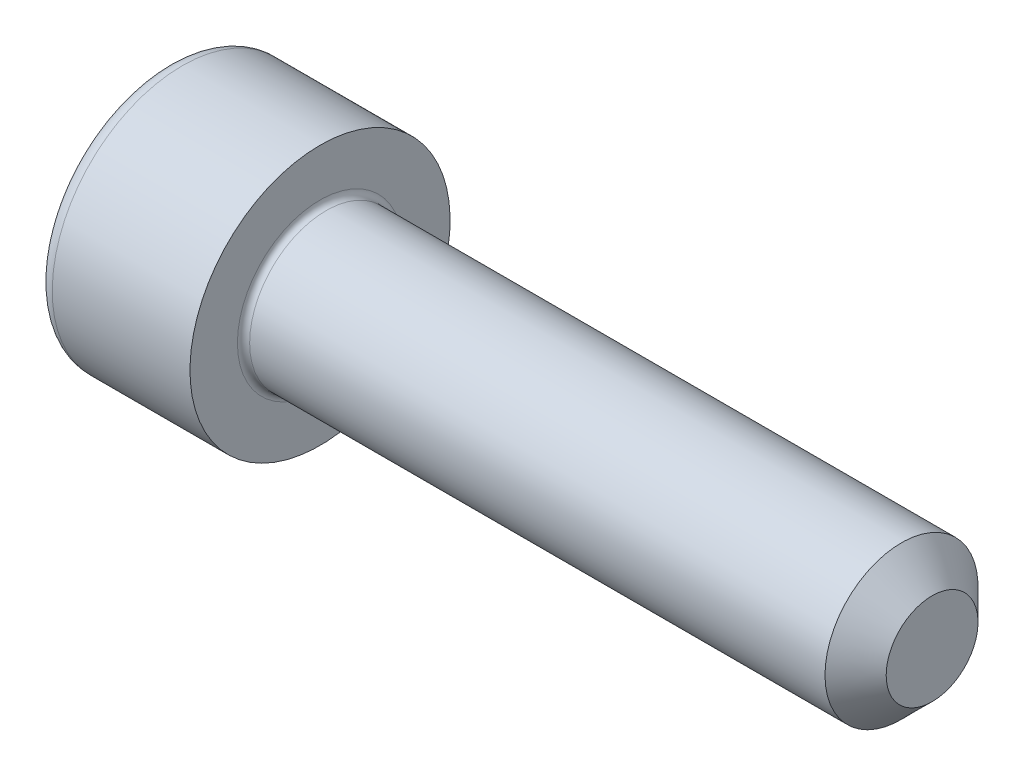
ISO-10303-21;
HEADER;
FILE_DESCRIPTION(('STEP AP214'),'2;1');
FILE_NAME('part.step','',(''),(''),'','','');
FILE_SCHEMA(('AUTOMOTIVE_DESIGN { 1 0 10303 214 1 1 1 1 }'));
ENDSEC;
DATA;
#1=APPLICATION_CONTEXT('core data for automotive mechanical design processes');
#2=APPLICATION_PROTOCOL_DEFINITION('international standard','automotive_design',2000,#1);
#3=PRODUCT_CONTEXT('',#1,'mechanical');
#4=PRODUCT('Part','Part','',(#3));
#5=PRODUCT_RELATED_PRODUCT_CATEGORY('part','',(#4));
#6=PRODUCT_DEFINITION_FORMATION('','',#4);
#7=PRODUCT_DEFINITION_CONTEXT('part definition',#1,'design');
#8=PRODUCT_DEFINITION('design','',#6,#7);
#9=PRODUCT_DEFINITION_SHAPE('','',#8);
#10=(LENGTH_UNIT() NAMED_UNIT(*) SI_UNIT(.MILLI.,.METRE.));
#11=(NAMED_UNIT(*) PLANE_ANGLE_UNIT() SI_UNIT($,.RADIAN.));
#12=(NAMED_UNIT(*) SI_UNIT($,.STERADIAN.) SOLID_ANGLE_UNIT());
#13=UNCERTAINTY_MEASURE_WITH_UNIT(LENGTH_MEASURE(1.E-05),#10,'distance_accuracy_value','');
#14=(GEOMETRIC_REPRESENTATION_CONTEXT(3) GLOBAL_UNCERTAINTY_ASSIGNED_CONTEXT((#13)) GLOBAL_UNIT_ASSIGNED_CONTEXT((#10,
#11,#12)) REPRESENTATION_CONTEXT('',''));
#15=CARTESIAN_POINT('',(0.,0.,0.));
#16=DIRECTION('',(0.,0.,1.));
#17=DIRECTION('',(1.,0.,0.));
#18=AXIS2_PLACEMENT_3D('',#15,#16,#17);
#19=CARTESIAN_POINT('',(-5.,0.,0.));
#20=DIRECTION('',(-1.,0.,0.));
#21=DIRECTION('',(0.,1.,0.));
#22=AXIS2_PLACEMENT_3D('',#19,#20,#21);
#23=PLANE('',#22);
#24=CARTESIAN_POINT('',(-5.,0.,0.));
#25=DIRECTION('',(1.,0.,0.));
#26=DIRECTION('',(0.,1.,0.));
#27=AXIS2_PLACEMENT_3D('',#24,#25,#26);
#28=CIRCLE('',#27,3.75);
#29=CARTESIAN_POINT('',(-5.,3.75,0.));
#30=VERTEX_POINT('',#29);
#31=EDGE_CURVE('E11',#30,#30,#28,.T.);
#32=ORIENTED_EDGE('',*,*,#31,.F.);
#33=EDGE_LOOP('',(#32));
#34=FACE_BOUND('',#33,.T.);
#35=DIRECTION('',(0.,0.500000000000001,-0.866025403784438));
#36=VECTOR('',#35,1.);
#37=CARTESIAN_POINT('',(-5.,1.15470053837925,2.));
#38=LINE('',#37,#36);
#39=CARTESIAN_POINT('',(-5.,1.15470053837925,2.));
#40=VERTEX_POINT('',#39);
#41=CARTESIAN_POINT('',(-5.,2.30940107675851,0.));
#42=VERTEX_POINT('',#41);
#43=EDGE_CURVE('E24',#40,#42,#38,.T.);
#44=ORIENTED_EDGE('',*,*,#43,.F.);
#45=DIRECTION('',(0.,1.,0.));
#46=VECTOR('',#45,1.);
#47=CARTESIAN_POINT('',(-5.,-1.15470053837925,2.));
#48=LINE('',#47,#46);
#49=CARTESIAN_POINT('',(-5.,-1.15470053837925,2.));
#50=VERTEX_POINT('',#49);
#51=EDGE_CURVE('E184',#50,#40,#48,.T.);
#52=ORIENTED_EDGE('',*,*,#51,.F.);
#53=DIRECTION('',(0.,0.5,0.866025403784439));
#54=VECTOR('',#53,1.);
#55=CARTESIAN_POINT('',(-5.,-2.30940107675851,0.));
#56=LINE('',#55,#54);
#57=CARTESIAN_POINT('',(-5.,-2.30940107675851,0.));
#58=VERTEX_POINT('',#57);
#59=EDGE_CURVE('E226',#58,#50,#56,.T.);
#60=ORIENTED_EDGE('',*,*,#59,.F.);
#61=DIRECTION('',(0.,-0.5,0.866025403784439));
#62=VECTOR('',#61,1.);
#63=CARTESIAN_POINT('',(-5.,-1.15470053837925,-2.));
#64=LINE('',#63,#62);
#65=CARTESIAN_POINT('',(-5.,-1.15470053837925,-2.));
#66=VERTEX_POINT('',#65);
#67=EDGE_CURVE('E133',#66,#58,#64,.T.);
#68=ORIENTED_EDGE('',*,*,#67,.F.);
#69=DIRECTION('',(0.,-1.,0.));
#70=VECTOR('',#69,1.);
#71=CARTESIAN_POINT('',(-5.,1.15470053837925,-2.));
#72=LINE('',#71,#70);
#73=CARTESIAN_POINT('',(-5.,1.15470053837925,-2.));
#74=VERTEX_POINT('',#73);
#75=EDGE_CURVE('E117',#74,#66,#72,.T.);
#76=ORIENTED_EDGE('',*,*,#75,.F.);
#77=DIRECTION('',(0.,-0.5,-0.866025403784439));
#78=VECTOR('',#77,1.);
#79=CARTESIAN_POINT('',(-5.,2.30940107675851,0.));
#80=LINE('',#79,#78);
#81=EDGE_CURVE('E111',#42,#74,#80,.T.);
#82=ORIENTED_EDGE('',*,*,#81,.F.);
#83=EDGE_LOOP('',(#44,#52,#60,#68,#76,#82));
#84=FACE_BOUND('',#83,.T.);
#85=ADVANCED_FACE('F17',(#34,#84),#23,.T.);
#86=CARTESIAN_POINT('',(-2.5,0.,0.));
#87=DIRECTION('',(-1.,0.,0.));
#88=DIRECTION('',(0.,0.,1.));
#89=AXIS2_PLACEMENT_3D('',#86,#87,#88);
#90=CONICAL_SURFACE('',#89,2.3094010767585,1.0471975511966);
#91=CARTESIAN_POINT('',(-1.16666666666667,0.,0.));
#92=VERTEX_POINT('',#91);
#93=VERTEX_LOOP('',#92);
#94=FACE_BOUND('',#93,.T.);
#95=CARTESIAN_POINT('',(-2.32136720504583,0.,1.99999999999985));
#96=CARTESIAN_POINT('',(-2.32131550241813,0.0797196102101617,2.00000000000306));
#97=CARTESIAN_POINT('',(-2.32411866043126,0.159413689200123,2.00000000000183));
#98=CARTESIAN_POINT('',(-2.33502998791878,0.318342403087673,1.99999999999818));
#99=CARTESIAN_POINT('',(-2.3431315531358,0.397577486228106,1.99999999999578));
#100=CARTESIAN_POINT('',(-2.36424196790677,0.555418039197688,1.99999999999748));
#101=CARTESIAN_POINT('',(-2.37725319872079,0.634023184574532,2.0000000000016));
#102=CARTESIAN_POINT('',(-2.40754514450711,0.790421298244566,1.99999999999841));
#103=CARTESIAN_POINT('',(-2.42482740199922,0.868213962499915,1.9999999999911));
#104=CARTESIAN_POINT('',(-2.46120934199551,1.01564572423579,1.99999999999472));
#105=CARTESIAN_POINT('',(-2.47998586173831,1.08536436762664,2.00000000000401));
#106=CARTESIAN_POINT('',(-2.5,1.15470053832392,2.00000000003195));
#107=B_SPLINE_CURVE_WITH_KNOTS('',3,(#95,#96,#97,#98,#99,#100,#101,#102,#103,#104,#105,#106),
.UNSPECIFIED.,.F.,.F.,(4,2,2,2,2,4),(0.,0.239068538986219,0.477839654877296,0.716726727438717,
0.955700202629129,1.17222815680731),.UNSPECIFIED.);
#108=CARTESIAN_POINT('',(-2.32136720504592,0.,2.));
#109=VERTEX_POINT('',#108);
#110=CARTESIAN_POINT('',(-2.49999999997221,1.15470053837925,2.));
#111=VERTEX_POINT('',#110);
#112=EDGE_CURVE('E179',#109,#111,#107,.T.);
#113=ORIENTED_EDGE('',*,*,#112,.T.);
#114=CARTESIAN_POINT('',(-2.49999999998611,1.15470053843378,1.99999999996852));
#115=CARTESIAN_POINT('',(-2.46228362849492,1.21997972300278,1.88693313528492));
#116=CARTESIAN_POINT('',(-2.42898652027917,1.28598045813641,1.77261650884483));
#117=CARTESIAN_POINT('',(-2.38655404777783,1.38958352282162,1.59317073714211));
#118=CARTESIAN_POINT('',(-2.37325675430922,1.42677343092606,1.52875592681503));
#119=CARTESIAN_POINT('',(-2.35093110027913,1.50147465395394,1.39936961300656));
#120=CARTESIAN_POINT('',(-2.34190226311298,1.53898593251758,1.33439817250222));
#121=CARTESIAN_POINT('',(-2.32591051793947,1.62921268695325,1.17812084989304));
#122=CARTESIAN_POINT('',(-2.32120225532939,1.68203400845146,1.08663163806296));
#123=CARTESIAN_POINT('',(-2.3215412281579,1.78767402974622,0.903657752348425));
#124=CARTESIAN_POINT('',(-2.32659003039377,1.84049272775946,0.812173081552283));
#125=CARTESIAN_POINT('',(-2.3460152406712,1.94632453428992,0.628867016694233));
#126=CARTESIAN_POINT('',(-2.36050249725211,1.99933241122694,0.537054684062406));
#127=CARTESIAN_POINT('',(-2.39754913624201,2.10464742363962,0.354643728709719));
#128=CARTESIAN_POINT('',(-2.42011316511624,2.15695413773811,0.264045835829832));
#129=CARTESIAN_POINT('',(-2.46265071941254,2.2425451198808,0.115797904891742));
#130=CARTESIAN_POINT('',(-2.48075490199722,2.27606376499449,0.0577419105088828));
#131=CARTESIAN_POINT('',(-2.49999999998611,2.3094010767585,5.73148604723116E-11));
#132=B_SPLINE_CURVE_WITH_KNOTS('',3,(#114,#115,#116,#117,#118,#119,#120,#121,#122,#123,#124,
#125,#126,#127,#128,#129,#130,#131),.UNSPECIFIED.,.F.,.F.,(4,2,2,2,2,2,2,2,4),(0.,
0.407777568841093,0.634364418722332,0.860925962529872,1.17771289725812,1.49455070611276,
1.81517832748425,2.13599069911638,2.34422944405424),.UNSPECIFIED.);
#133=CARTESIAN_POINT('',(-2.49999999997221,2.30940107675851,0.));
#134=VERTEX_POINT('',#133);
#135=EDGE_CURVE('E165',#111,#134,#132,.T.);
#136=ORIENTED_EDGE('',*,*,#135,.T.);
#137=CARTESIAN_POINT('',(-2.49999999998611,2.3094010767585,-6.38932573467605E-11));
#138=CARTESIAN_POINT('',(-2.4622836284956,2.24412189190189,-0.113066864578103));
#139=CARTESIAN_POINT('',(-2.42898652028046,2.17812115689804,-0.227383491089732));
#140=CARTESIAN_POINT('',(-2.38655404777963,2.07451809234659,-0.406829262864516));
#141=CARTESIAN_POINT('',(-2.37325675431111,2.03732818427636,-0.471244073209609));
#142=CARTESIAN_POINT('',(-2.35093110028098,1.96262696113167,-0.600630386947137));
#143=CARTESIAN_POINT('',(-2.34190226311472,1.92511568241702,-0.665601827362531));
#144=CARTESIAN_POINT('',(-2.32591051794074,1.83488892822205,-0.821879150105676));
#145=CARTESIAN_POINT('',(-2.32120225533013,1.7820676073555,-0.91336836229718));
#146=CARTESIAN_POINT('',(-2.32154122815707,1.67642758474773,-1.09634224724721));
#147=CARTESIAN_POINT('',(-2.3265900303919,1.62360888478942,-1.18782691691719));
#148=CARTESIAN_POINT('',(-2.3460152406666,1.51777707922394,-1.37113298232285));
#149=CARTESIAN_POINT('',(-2.36050249724555,1.46476920525531,-1.46294531666216));
#150=CARTESIAN_POINT('',(-2.39754913623093,1.359454190203,-1.64535627047848));
#151=CARTESIAN_POINT('',(-2.42011316510261,1.30714747049154,-1.73595416011166));
#152=CARTESIAN_POINT('',(-2.46265071940074,1.2215564873035,-1.88420209046589));
#153=CARTESIAN_POINT('',(-2.48075490199095,1.18803784387184,-1.94225808584523));
#154=CARTESIAN_POINT('',(-2.4999999999861,1.15470053842888,-1.99999999997135));
#155=B_SPLINE_CURVE_WITH_KNOTS('',3,(#137,#138,#139,#140,#141,#142,#143,#144,#145,#146,#147,
#148,#149,#150,#151,#152,#153,#154),.UNSPECIFIED.,.F.,.F.,(4,2,2,2,2,2,2,2,4),(0.,
0.407777568832167,0.634364418708909,0.860925962511965,1.17771289723187,1.49455070607814,
1.81517832743263,2.13599069904778,2.3442294440535),.UNSPECIFIED.);
#156=CARTESIAN_POINT('',(-2.49999999997221,1.15470053837925,-2.));
#157=VERTEX_POINT('',#156);
#158=EDGE_CURVE('E151',#134,#157,#155,.T.);
#159=ORIENTED_EDGE('',*,*,#158,.T.);
#160=CARTESIAN_POINT('',(-2.4999999999861,1.15470053832392,-2.00000000003195));
#161=CARTESIAN_POINT('',(-2.46228362849563,1.02414216890014,-1.99999999986489));
#162=CARTESIAN_POINT('',(-2.4289865202805,0.892140698764289,-1.99999999993892));
#163=CARTESIAN_POINT('',(-2.38655404777969,0.684934569530033,-2.00000000001483));
#164=CARTESIAN_POINT('',(-2.37325675431117,0.610554753356163,-2.00000000003416));
#165=CARTESIAN_POINT('',(-2.35093110028104,0.461152307185191,-1.99999999996585));
#166=CARTESIAN_POINT('',(-2.34190226311477,0.386129749907719,-1.99999999987822));
#167=CARTESIAN_POINT('',(-2.32591051794077,0.205676241279372,-2.00000000001593));
#168=CARTESIAN_POINT('',(-2.32120225533015,0.100033598916102,-2.00000000037981));
#169=CARTESIAN_POINT('',(-2.32154122815705,-0.111246444983501,-1.99999999962013));
#170=CARTESIAN_POINT('',(-2.32659003039185,-0.216883842953614,-1.99999999849635));
#171=CARTESIAN_POINT('',(-2.34601524066647,-0.428547455045295,-1.9999999990511));
#172=CARTESIAN_POINT('',(-2.36050249724539,-0.534563205948143,-2.00000000076332));
#173=CARTESIAN_POINT('',(-2.39754913623069,-0.74519323340766,-1.99999999923624));
#174=CARTESIAN_POINT('',(-2.42011316510232,-0.849806667214919,-1.99999999599407));
#175=CARTESIAN_POINT('',(-2.4626507194005,-1.02098863255456,-1.99999999539546));
#176=CARTESIAN_POINT('',(-2.48075490199082,-1.08802592111134,-1.99999999637292));
#177=CARTESIAN_POINT('',(-2.4999999999861,-1.15470053832962,-2.00000000002866));
#178=B_SPLINE_CURVE_WITH_KNOTS('',3,(#160,#161,#162,#163,#164,#165,#166,#167,#168,#169,#170,
#171,#172,#173,#174,#175,#176,#177),.UNSPECIFIED.,.F.,.F.,(4,2,2,2,2,2,2,2,4),(0.,
0.407777568831901,0.634364418708497,0.860925962511407,1.1777128972311,1.49455070607716,
1.81517832743144,2.13599069904639,2.3442294440535),.UNSPECIFIED.);
#179=CARTESIAN_POINT('',(-2.49999999997221,-1.15470053837925,-2.));
#180=VERTEX_POINT('',#179);
#181=EDGE_CURVE('E126',#157,#180,#178,.T.);
#182=ORIENTED_EDGE('',*,*,#181,.T.);
#183=CARTESIAN_POINT('',(-2.4999999999861,-1.15470053843459,-1.99999999996805));
#184=CARTESIAN_POINT('',(-2.46228362849561,-1.21997972300183,-1.88693313528679));
#185=CARTESIAN_POINT('',(-2.42898652028047,-1.28598045813391,-1.77261650884921));
#186=CARTESIAN_POINT('',(-2.38655404777964,-1.38958352281684,-1.59317073715036));
#187=CARTESIAN_POINT('',(-2.37325675431112,-1.42677343092053,-1.5287559268246));
#188=CARTESIAN_POINT('',(-2.35093110028099,-1.50147465394689,-1.39936961301878));
#189=CARTESIAN_POINT('',(-2.34190226311473,-1.53898593250976,-1.33439817251576));
#190=CARTESIAN_POINT('',(-2.32591051794074,-1.62921268694325,-1.17812084991035));
#191=CARTESIAN_POINT('',(-2.32120225533014,-1.68203400844004,-1.08663163808273));
#192=CARTESIAN_POINT('',(-2.32154122815707,-1.787674029732,-0.903657752373051));
#193=CARTESIAN_POINT('',(-2.32659003039189,-1.84049272774386,-0.812173081579306));
#194=CARTESIAN_POINT('',(-2.34601524066657,-1.94632453427018,-0.62886701672843));
#195=CARTESIAN_POINT('',(-2.36050249724552,-1.99933241120445,-0.537054684101358));
#196=CARTESIAN_POINT('',(-2.39754913623088,-2.10464742361175,-0.354643728757994));
#197=CARTESIAN_POINT('',(-2.42011316510254,-2.1569541377076,-0.264045835882673));
#198=CARTESIAN_POINT('',(-2.46265071940069,-2.24254511985885,-0.115797904929758));
#199=CARTESIAN_POINT('',(-2.48075490199092,-2.27606376498357,-0.0577419105277827));
#200=CARTESIAN_POINT('',(-2.49999999998611,-2.3094010767585,-5.7309482651391E-11));
#201=B_SPLINE_CURVE_WITH_KNOTS('',3,(#183,#184,#185,#186,#187,#188,#189,#190,#191,#192,#193,
#194,#195,#196,#197,#198,#199,#200),.UNSPECIFIED.,.F.,.F.,(4,2,2,2,2,2,2,2,4),(0.,
0.407777568832121,0.634364418708837,0.860925962511868,1.17771289723173,1.49455070607796,
1.81517832743237,2.13599069904745,2.3442294440535),.UNSPECIFIED.);
#202=CARTESIAN_POINT('',(-2.49999999997221,-2.30940107675851,0.));
#203=VERTEX_POINT('',#202);
#204=EDGE_CURVE('E158',#180,#203,#201,.T.);
#205=ORIENTED_EDGE('',*,*,#204,.T.);
#206=CARTESIAN_POINT('',(-2.49999999998611,-2.3094010767585,6.38977724912849E-11));
#207=CARTESIAN_POINT('',(-2.46228362849561,-2.24412189190191,0.113066864578085));
#208=CARTESIAN_POINT('',(-2.42898652028047,-2.17812115689806,0.227383491089691));
#209=CARTESIAN_POINT('',(-2.38655404777965,-2.07451809234663,0.406829262864438));
#210=CARTESIAN_POINT('',(-2.37325675431113,-2.03732818427642,0.471244073209517));
#211=CARTESIAN_POINT('',(-2.350931100281,-1.96262696113174,0.600630386947018));
#212=CARTESIAN_POINT('',(-2.34190226311473,-1.9251156824171,0.665601827362399));
#213=CARTESIAN_POINT('',(-2.32591051794075,-1.83488892822215,0.821879150105511));
#214=CARTESIAN_POINT('',(-2.32120225533014,-1.78206760735561,0.913368362296995));
#215=CARTESIAN_POINT('',(-2.32154122815707,-1.67642758474786,1.09634224724699));
#216=CARTESIAN_POINT('',(-2.32659003039189,-1.62360888478956,1.18782691691694));
#217=CARTESIAN_POINT('',(-2.34601524066656,-1.51777707922411,1.37113298232257));
#218=CARTESIAN_POINT('',(-2.3605024972455,-1.46476920525549,1.46294531666186));
#219=CARTESIAN_POINT('',(-2.39754913623086,-1.35945419020319,1.64535627047814));
#220=CARTESIAN_POINT('',(-2.42011316510251,-1.30714747049175,1.7359541601113));
#221=CARTESIAN_POINT('',(-2.46265071940067,-1.22155648730365,1.88420209046564));
#222=CARTESIAN_POINT('',(-2.48075490199091,-1.18803784387191,1.9422580858451));
#223=CARTESIAN_POINT('',(-2.49999999998611,-1.15470053842889,1.99999999997134));
#224=B_SPLINE_CURVE_WITH_KNOTS('',3,(#206,#207,#208,#209,#210,#211,#212,#213,#214,#215,#216,
#217,#218,#219,#220,#221,#222,#223),.UNSPECIFIED.,.F.,.F.,(4,2,2,2,2,2,2,2,4),(0.,
0.407777568832085,0.634364418708781,0.860925962511791,1.17771289723162,1.49455070607783,
1.81517832743225,2.13599069904732,2.34422944405349),.UNSPECIFIED.);
#225=CARTESIAN_POINT('',(-2.49999999997221,-1.15470053837925,2.));
#226=VERTEX_POINT('',#225);
#227=EDGE_CURVE('E172',#203,#226,#224,.T.);
#228=ORIENTED_EDGE('',*,*,#227,.T.);
#229=CARTESIAN_POINT('',(-2.49999999998611,-1.15470053832392,2.00000000003195));
#230=CARTESIAN_POINT('',(-2.47488586884173,-1.06770564660957,2.00000000002455));
#231=CARTESIAN_POINT('',(-2.45171842086109,-0.980086332860074,2.00000000000963));
#232=CARTESIAN_POINT('',(-2.4102156404833,-0.803579815537697,1.99999999999036));
#233=CARTESIAN_POINT('',(-2.39188764625717,-0.71469089951397,1.99999999998601));
#234=CARTESIAN_POINT('',(-2.3631145018882,-0.547674670195806,2.00000000001183));
#235=CARTESIAN_POINT('',(-2.35194868794953,-0.469673441102498,2.00000000003752));
#236=CARTESIAN_POINT('',(-2.33459755429522,-0.313163070549436,1.99999999996251));
#237=CARTESIAN_POINT('',(-2.32840835880135,-0.234654372436433,1.99999999986191));
#238=CARTESIAN_POINT('',(-2.32370864271904,-0.130051790428277,1.9999999999398));
#239=CARTESIAN_POINT('',(-2.32283138027988,-0.104051512701441,1.99999999997654));
#240=CARTESIAN_POINT('',(-2.32166060243322,-0.0520347058284984,2.00000000002347));
#241=CARTESIAN_POINT('',(-2.32136715710422,-0.0260181751063475,2.00000000003364));
#242=CARTESIAN_POINT('',(-2.32136720504583,0.,1.99999999999985));
#243=B_SPLINE_CURVE_WITH_KNOTS('',3,(#229,#230,#231,#232,#233,#234,#235,#236,#237,#238,#239,
#240,#241,#242),.UNSPECIFIED.,.F.,.F.,(4,2,2,2,2,2,4),(0.,0.271712623420874,0.543834915006432,
0.780083913555509,1.01614874327482,1.09418899413783,1.17223861199891),.UNSPECIFIED.);
#244=EDGE_CURVE('E183',#226,#109,#243,.T.);
#245=ORIENTED_EDGE('',*,*,#244,.T.);
#246=EDGE_LOOP('',(#113,#136,#159,#182,#205,#228,#245));
#247=FACE_BOUND('',#246,.T.);
#248=ADVANCED_FACE('F139',(#94,#247),#90,.F.);
#249=CARTESIAN_POINT('',(0.195534180126147,-1.15470053837925,2.));
#250=DIRECTION('',(0.,0.,1.));
#251=DIRECTION('',(0.,1.,0.));
#252=AXIS2_PLACEMENT_3D('',#249,#250,#251);
#253=PLANE('',#252);
#254=ORIENTED_EDGE('',*,*,#244,.F.);
#255=DIRECTION('',(-1.,0.,0.));
#256=VECTOR('',#255,1.);
#257=CARTESIAN_POINT('',(-2.49999999997221,-1.15470053837925,2.));
#258=LINE('',#257,#256);
#259=EDGE_CURVE('E222',#226,#50,#258,.T.);
#260=ORIENTED_EDGE('',*,*,#259,.T.);
#261=ORIENTED_EDGE('',*,*,#51,.T.);
#262=DIRECTION('',(-1.,0.,0.));
#263=VECTOR('',#262,1.);
#264=CARTESIAN_POINT('',(-2.49999999997221,1.15470053837925,2.));
#265=LINE('',#264,#263);
#266=EDGE_CURVE('E120',#111,#40,#265,.T.);
#267=ORIENTED_EDGE('',*,*,#266,.F.);
#268=ORIENTED_EDGE('',*,*,#112,.F.);
#269=EDGE_LOOP('',(#254,#260,#261,#267,#268));
#270=FACE_BOUND('',#269,.T.);
#271=ADVANCED_FACE('F143',(#270),#253,.F.);
#272=CARTESIAN_POINT('',(0.195534180126147,-2.30940107675851,0.));
#273=DIRECTION('',(0.,-0.866025403784438,0.5));
#274=DIRECTION('',(0.,0.5,0.866025403784438));
#275=AXIS2_PLACEMENT_3D('',#272,#273,#274);
#276=PLANE('',#275);
#277=ORIENTED_EDGE('',*,*,#227,.F.);
#278=DIRECTION('',(-1.,0.,0.));
#279=VECTOR('',#278,1.);
#280=CARTESIAN_POINT('',(-2.49999999997221,-2.30940107675851,0.));
#281=LINE('',#280,#279);
#282=EDGE_CURVE('E229',#203,#58,#281,.T.);
#283=ORIENTED_EDGE('',*,*,#282,.T.);
#284=ORIENTED_EDGE('',*,*,#59,.T.);
#285=ORIENTED_EDGE('',*,*,#259,.F.);
#286=EDGE_LOOP('',(#277,#283,#284,#285));
#287=FACE_BOUND('',#286,.T.);
#288=ADVANCED_FACE('F190',(#287),#276,.F.);
#289=CARTESIAN_POINT('',(0.195534180126147,-1.15470053837925,-2.));
#290=DIRECTION('',(0.,-0.866025403784439,-0.5));
#291=DIRECTION('',(0.,-0.5,0.866025403784439));
#292=AXIS2_PLACEMENT_3D('',#289,#290,#291);
#293=PLANE('',#292);
#294=ORIENTED_EDGE('',*,*,#204,.F.);
#295=DIRECTION('',(-1.,0.,0.));
#296=VECTOR('',#295,1.);
#297=CARTESIAN_POINT('',(-2.49999999997221,-1.15470053837925,-2.));
#298=LINE('',#297,#296);
#299=EDGE_CURVE('E123',#180,#66,#298,.T.);
#300=ORIENTED_EDGE('',*,*,#299,.T.);
#301=ORIENTED_EDGE('',*,*,#67,.T.);
#302=ORIENTED_EDGE('',*,*,#282,.F.);
#303=EDGE_LOOP('',(#294,#300,#301,#302));
#304=FACE_BOUND('',#303,.T.);
#305=ADVANCED_FACE('F201',(#304),#293,.F.);
#306=CARTESIAN_POINT('',(0.195534180126147,1.15470053837925,-2.));
#307=DIRECTION('',(0.,0.,-1.));
#308=DIRECTION('',(0.,-1.,0.));
#309=AXIS2_PLACEMENT_3D('',#306,#307,#308);
#310=PLANE('',#309);
#311=ORIENTED_EDGE('',*,*,#181,.F.);
#312=DIRECTION('',(-1.,0.,0.));
#313=VECTOR('',#312,1.);
#314=CARTESIAN_POINT('',(-2.49999999997221,1.15470053837925,-2.));
#315=LINE('',#314,#313);
#316=EDGE_CURVE('E114',#157,#74,#315,.T.);
#317=ORIENTED_EDGE('',*,*,#316,.T.);
#318=ORIENTED_EDGE('',*,*,#75,.T.);
#319=ORIENTED_EDGE('',*,*,#299,.F.);
#320=EDGE_LOOP('',(#311,#317,#318,#319));
#321=FACE_BOUND('',#320,.T.);
#322=ADVANCED_FACE('F135',(#321),#310,.F.);
#323=CARTESIAN_POINT('',(0.195534180126147,2.30940107675851,0.));
#324=DIRECTION('',(0.,0.866025403784439,-0.5));
#325=DIRECTION('',(0.,-0.5,-0.866025403784439));
#326=AXIS2_PLACEMENT_3D('',#323,#324,#325);
#327=PLANE('',#326);
#328=ORIENTED_EDGE('',*,*,#158,.F.);
#329=DIRECTION('',(-1.,0.,0.));
#330=VECTOR('',#329,1.);
#331=CARTESIAN_POINT('',(-2.49999999997221,2.30940107675851,0.));
#332=LINE('',#331,#330);
#333=EDGE_CURVE('E108',#134,#42,#332,.T.);
#334=ORIENTED_EDGE('',*,*,#333,.T.);
#335=ORIENTED_EDGE('',*,*,#81,.T.);
#336=ORIENTED_EDGE('',*,*,#316,.F.);
#337=EDGE_LOOP('',(#328,#334,#335,#336));
#338=FACE_BOUND('',#337,.T.);
#339=ADVANCED_FACE('F197',(#338),#327,.F.);
#340=CARTESIAN_POINT('',(0.195534180126147,1.15470053837925,2.));
#341=DIRECTION('',(0.,0.866025403784438,0.500000000000001));
#342=DIRECTION('',(0.,0.500000000000001,-0.866025403784438));
#343=AXIS2_PLACEMENT_3D('',#340,#341,#342);
#344=PLANE('',#343);
#345=ORIENTED_EDGE('',*,*,#135,.F.);
#346=ORIENTED_EDGE('',*,*,#266,.T.);
#347=ORIENTED_EDGE('',*,*,#43,.T.);
#348=ORIENTED_EDGE('',*,*,#333,.F.);
#349=EDGE_LOOP('',(#345,#346,#347,#348));
#350=FACE_BOUND('',#349,.T.);
#351=ADVANCED_FACE('F192',(#350),#344,.F.);
#352=CARTESIAN_POINT('',(-5.,0.,0.));
#353=DIRECTION('',(1.,0.,0.));
#354=DIRECTION('',(0.,1.,0.));
#355=AXIS2_PLACEMENT_3D('',#352,#353,#354);
#356=CYLINDRICAL_SURFACE('',#355,4.25);
#357=CARTESIAN_POINT('',(0.,0.,0.));
#358=DIRECTION('',(1.,0.,0.));
#359=DIRECTION('',(0.,1.,0.));
#360=AXIS2_PLACEMENT_3D('',#357,#358,#359);
#361=CIRCLE('',#360,4.25);
#362=CARTESIAN_POINT('',(0.,4.25,0.));
#363=VERTEX_POINT('',#362);
#364=EDGE_CURVE('E105',#363,#363,#361,.T.);
#365=ORIENTED_EDGE('',*,*,#364,.F.);
#366=EDGE_LOOP('',(#365));
#367=FACE_BOUND('',#366,.T.);
#368=CARTESIAN_POINT('',(-4.5,0.,0.));
#369=DIRECTION('',(1.,0.,0.));
#370=DIRECTION('',(0.,1.,0.));
#371=AXIS2_PLACEMENT_3D('',#368,#369,#370);
#372=CIRCLE('',#371,4.25);
#373=CARTESIAN_POINT('',(-4.5,4.25,0.));
#374=VERTEX_POINT('',#373);
#375=EDGE_CURVE('E103',#374,#374,#372,.T.);
#376=ORIENTED_EDGE('',*,*,#375,.T.);
#377=EDGE_LOOP('',(#376));
#378=FACE_BOUND('',#377,.T.);
#379=ADVANCED_FACE('F196',(#367,#378),#356,.T.);
#380=CARTESIAN_POINT('',(0.,0.,0.));
#381=DIRECTION('',(1.,0.,0.));
#382=DIRECTION('',(0.,1.,0.));
#383=AXIS2_PLACEMENT_3D('',#380,#381,#382);
#384=PLANE('',#383);
#385=ORIENTED_EDGE('',*,*,#364,.T.);
#386=EDGE_LOOP('',(#385));
#387=FACE_BOUND('',#386,.T.);
#388=CARTESIAN_POINT('',(0.,0.,0.));
#389=DIRECTION('',(1.,0.,0.));
#390=DIRECTION('',(0.,0.,1.));
#391=AXIS2_PLACEMENT_3D('',#388,#389,#390);
#392=CIRCLE('',#391,2.7);
#393=CARTESIAN_POINT('',(0.,0.,2.7));
#394=VERTEX_POINT('',#393);
#395=EDGE_CURVE('E95',#394,#394,#392,.T.);
#396=ORIENTED_EDGE('',*,*,#395,.F.);
#397=EDGE_LOOP('',(#396));
#398=FACE_BOUND('',#397,.T.);
#399=ADVANCED_FACE('F244',(#387,#398),#384,.T.);
#400=CARTESIAN_POINT('',(0.,0.,0.));
#401=DIRECTION('',(1.,0.,0.));
#402=DIRECTION('',(0.,0.,1.));
#403=AXIS2_PLACEMENT_3D('',#400,#401,#402);
#404=CYLINDRICAL_SURFACE('',#403,2.5);
#405=CARTESIAN_POINT('',(19.,0.,0.));
#406=DIRECTION('',(1.,0.,0.));
#407=DIRECTION('',(0.,0.,1.));
#408=AXIS2_PLACEMENT_3D('',#405,#406,#407);
#409=CIRCLE('',#408,2.5);
#410=CARTESIAN_POINT('',(19.,0.,2.5));
#411=VERTEX_POINT('',#410);
#412=EDGE_CURVE('E100',#411,#411,#409,.T.);
#413=ORIENTED_EDGE('',*,*,#412,.F.);
#414=EDGE_LOOP('',(#413));
#415=FACE_BOUND('',#414,.T.);
#416=CARTESIAN_POINT('',(0.2,0.,0.));
#417=DIRECTION('',(1.,0.,0.));
#418=DIRECTION('',(0.,0.,1.));
#419=AXIS2_PLACEMENT_3D('',#416,#417,#418);
#420=CIRCLE('',#419,2.5);
#421=CARTESIAN_POINT('',(0.2,0.,2.5));
#422=VERTEX_POINT('',#421);
#423=EDGE_CURVE('E89',#422,#422,#420,.T.);
#424=ORIENTED_EDGE('',*,*,#423,.T.);
#425=EDGE_LOOP('',(#424));
#426=FACE_BOUND('',#425,.T.);
#427=ADVANCED_FACE('F90',(#415,#426),#404,.T.);
#428=CARTESIAN_POINT('',(19.,0.,0.));
#429=DIRECTION('',(-1.,0.,0.));
#430=DIRECTION('',(0.,0.,1.));
#431=AXIS2_PLACEMENT_3D('',#428,#429,#430);
#432=CONICAL_SURFACE('',#431,2.5,0.785398163397448);
#433=CARTESIAN_POINT('',(20.,0.,0.));
#434=DIRECTION('',(1.,0.,0.));
#435=DIRECTION('',(0.,0.,1.));
#436=AXIS2_PLACEMENT_3D('',#433,#434,#435);
#437=CIRCLE('',#436,1.5);
#438=CARTESIAN_POINT('',(20.,0.,1.5));
#439=VERTEX_POINT('',#438);
#440=EDGE_CURVE('E92',#439,#439,#437,.T.);
#441=ORIENTED_EDGE('',*,*,#440,.F.);
#442=EDGE_LOOP('',(#441));
#443=FACE_BOUND('',#442,.T.);
#444=ORIENTED_EDGE('',*,*,#412,.T.);
#445=EDGE_LOOP('',(#444));
#446=FACE_BOUND('',#445,.T.);
#447=ADVANCED_FACE('F251',(#443,#446),#432,.T.);
#448=CARTESIAN_POINT('',(20.,0.,0.));
#449=DIRECTION('',(1.,0.,0.));
#450=DIRECTION('',(0.,0.,1.));
#451=AXIS2_PLACEMENT_3D('',#448,#449,#450);
#452=PLANE('',#451);
#453=ORIENTED_EDGE('',*,*,#440,.T.);
#454=EDGE_LOOP('',(#453));
#455=FACE_BOUND('',#454,.T.);
#456=ADVANCED_FACE('F255',(#455),#452,.T.);
#457=CARTESIAN_POINT('',(-4.5,0.,0.));
#458=DIRECTION('',(1.,0.,0.));
#459=DIRECTION('',(0.,1.,0.));
#460=AXIS2_PLACEMENT_3D('',#457,#458,#459);
#461=TOROIDAL_SURFACE('',#460,3.75,0.5);
#462=ORIENTED_EDGE('',*,*,#375,.F.);
#463=EDGE_LOOP('',(#462));
#464=FACE_BOUND('',#463,.T.);
#465=ORIENTED_EDGE('',*,*,#31,.T.);
#466=EDGE_LOOP('',(#465));
#467=FACE_BOUND('',#466,.T.);
#468=ADVANCED_FACE('F144',(#464,#467),#461,.T.);
#469=CARTESIAN_POINT('',(0.2,0.,0.));
#470=DIRECTION('',(1.,0.,0.));
#471=DIRECTION('',(0.,0.,1.));
#472=AXIS2_PLACEMENT_3D('',#469,#470,#471);
#473=TOROIDAL_SURFACE('',#472,2.7,0.2);
#474=ORIENTED_EDGE('',*,*,#423,.F.);
#475=EDGE_LOOP('',(#474));
#476=FACE_BOUND('',#475,.T.);
#477=ORIENTED_EDGE('',*,*,#395,.T.);
#478=EDGE_LOOP('',(#477));
#479=FACE_BOUND('',#478,.T.);
#480=ADVANCED_FACE('F257',(#476,#479),#473,.F.);
#481=CLOSED_SHELL('',(#85,#248,#271,#288,#305,#322,#339,#351,#379,#399,#427,#447,#456,#468,#480));
#482=MANIFOLD_SOLID_BREP('B1',#481);
#483=ADVANCED_BREP_SHAPE_REPRESENTATION('',(#18,#482),#14);
#484=SHAPE_DEFINITION_REPRESENTATION(#9,#483);
ENDSEC;
END-ISO-10303-21;
